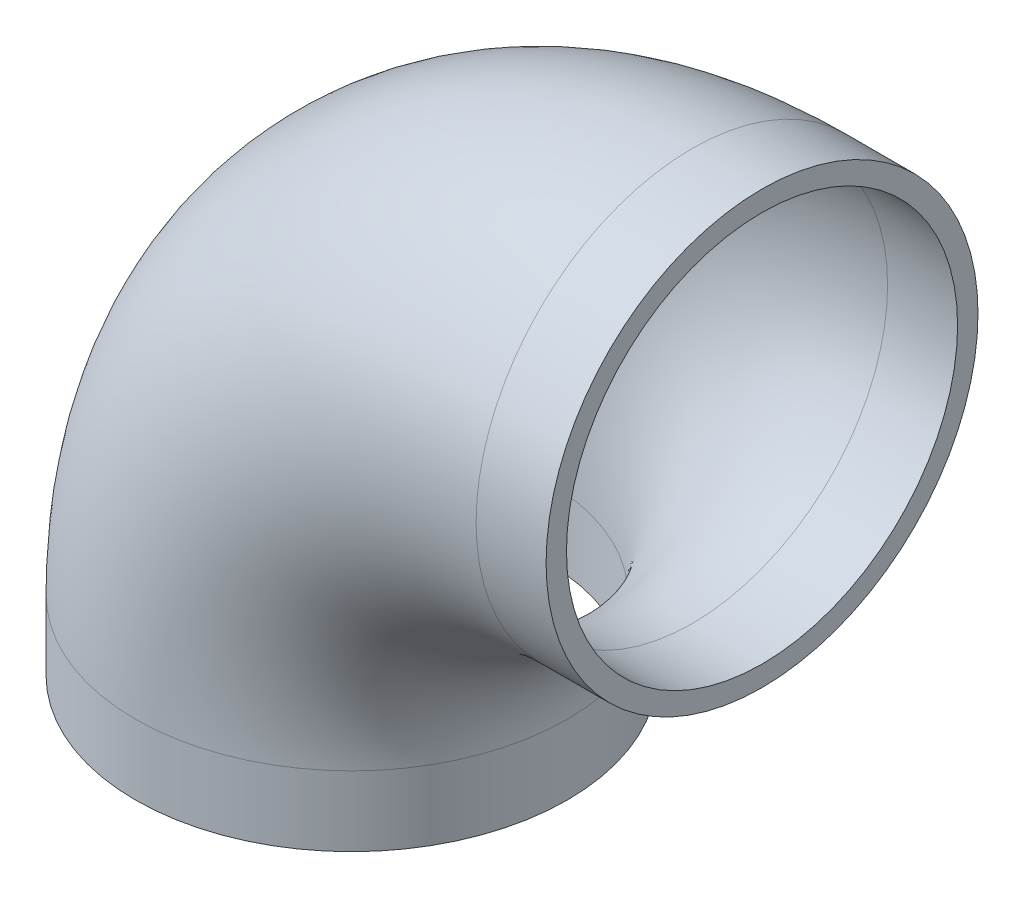
ISO-10303-21;
HEADER;
FILE_DESCRIPTION(('STEP AP214'),'2;1');
FILE_NAME('part.step','',(''),(''),'','','');
FILE_SCHEMA(('AUTOMOTIVE_DESIGN { 1 0 10303 214 1 1 1 1 }'));
ENDSEC;
DATA;
#1=APPLICATION_CONTEXT('core data for automotive mechanical design processes');
#2=APPLICATION_PROTOCOL_DEFINITION('international standard','automotive_design',2000,#1);
#3=PRODUCT_CONTEXT('',#1,'mechanical');
#4=PRODUCT('Part','Part','',(#3));
#5=PRODUCT_RELATED_PRODUCT_CATEGORY('part','',(#4));
#6=PRODUCT_DEFINITION_FORMATION('','',#4);
#7=PRODUCT_DEFINITION_CONTEXT('part definition',#1,'design');
#8=PRODUCT_DEFINITION('design','',#6,#7);
#9=PRODUCT_DEFINITION_SHAPE('','',#8);
#10=(LENGTH_UNIT() NAMED_UNIT(*) SI_UNIT(.MILLI.,.METRE.));
#11=(NAMED_UNIT(*) PLANE_ANGLE_UNIT() SI_UNIT($,.RADIAN.));
#12=(NAMED_UNIT(*) SI_UNIT($,.STERADIAN.) SOLID_ANGLE_UNIT());
#13=UNCERTAINTY_MEASURE_WITH_UNIT(LENGTH_MEASURE(1.E-05),#10,'distance_accuracy_value','');
#14=(GEOMETRIC_REPRESENTATION_CONTEXT(3) GLOBAL_UNCERTAINTY_ASSIGNED_CONTEXT((#13)) GLOBAL_UNIT_ASSIGNED_CONTEXT((#10,
#11,#12)) REPRESENTATION_CONTEXT('',''));
#15=CARTESIAN_POINT('',(0.,0.,0.));
#16=DIRECTION('',(0.,0.,1.));
#17=DIRECTION('',(1.,0.,0.));
#18=AXIS2_PLACEMENT_3D('',#15,#16,#17);
#19=CARTESIAN_POINT('',(0.,0.,0.));
#20=DIRECTION('',(0.,1.,0.));
#21=DIRECTION('',(0.,0.,1.));
#22=AXIS2_PLACEMENT_3D('',#19,#20,#21);
#23=CYLINDRICAL_SURFACE('',#22,84.15);
#24=CARTESIAN_POINT('',(0.,27.27,0.));
#25=DIRECTION('',(0.,1.,0.));
#26=DIRECTION('',(0.,0.,1.));
#27=AXIS2_PLACEMENT_3D('',#24,#25,#26);
#28=CIRCLE('',#27,84.15);
#29=CARTESIAN_POINT('',(-84.15,27.27,0.));
#30=VERTEX_POINT('',#29);
#31=EDGE_CURVE('E66',#30,#30,#28,.T.);
#32=ORIENTED_EDGE('',*,*,#31,.F.);
#33=EDGE_LOOP('',(#32));
#34=FACE_BOUND('',#33,.T.);
#35=CARTESIAN_POINT('',(0.,0.,0.));
#36=DIRECTION('',(0.,1.,0.));
#37=DIRECTION('',(0.,0.,1.));
#38=AXIS2_PLACEMENT_3D('',#35,#36,#37);
#39=CIRCLE('',#38,84.15);
#40=CARTESIAN_POINT('',(0.,0.,84.15));
#41=VERTEX_POINT('',#40);
#42=EDGE_CURVE('E63',#41,#41,#39,.T.);
#43=ORIENTED_EDGE('',*,*,#42,.T.);
#44=EDGE_LOOP('',(#43));
#45=FACE_BOUND('',#44,.T.);
#46=ADVANCED_FACE('F39',(#34,#45),#23,.T.);
#47=CARTESIAN_POINT('',(132.73,27.27,0.));
#48=DIRECTION('',(0.,0.,-1.));
#49=DIRECTION('',(-1.,0.,0.));
#50=AXIS2_PLACEMENT_3D('',#47,#48,#49);
#51=TOROIDAL_SURFACE('',#50,132.73,84.15);
#52=CARTESIAN_POINT('',(132.73,160.,0.));
#53=DIRECTION('',(1.,0.,0.));
#54=DIRECTION('',(0.,0.,1.));
#55=AXIS2_PLACEMENT_3D('',#52,#53,#54);
#56=CIRCLE('',#55,84.15);
#57=CARTESIAN_POINT('',(132.73,244.15,0.));
#58=VERTEX_POINT('',#57);
#59=EDGE_CURVE('E43',#58,#58,#56,.T.);
#60=CARTESIAN_POINT('',(132.73,27.27,0.));
#61=DIRECTION('',(0.,0.,-1.));
#62=DIRECTION('',(-1.,0.,0.));
#63=AXIS2_PLACEMENT_3D('',#60,#61,#62);
#64=CIRCLE('',#63,216.88);
#65=EDGE_CURVE('',#30,#58,#64,.T.);
#66=ORIENTED_EDGE('',*,*,#31,.T.);
#67=ORIENTED_EDGE('',*,*,#59,.F.);
#68=ORIENTED_EDGE('',*,*,#65,.T.);
#69=ORIENTED_EDGE('',*,*,#65,.F.);
#70=EDGE_LOOP('',(#66,#68,#67,#69));
#71=FACE_BOUND('',#70,.T.);
#72=ADVANCED_FACE('F76',(#71),#51,.T.);
#73=CARTESIAN_POINT('',(132.73,160.,0.));
#74=DIRECTION('',(1.,0.,0.));
#75=DIRECTION('',(0.,0.,-1.));
#76=AXIS2_PLACEMENT_3D('',#73,#74,#75);
#77=CYLINDRICAL_SURFACE('',#76,84.15);
#78=CARTESIAN_POINT('',(160.,160.,0.));
#79=DIRECTION('',(1.,0.,0.));
#80=DIRECTION('',(0.,0.,1.));
#81=AXIS2_PLACEMENT_3D('',#78,#79,#80);
#82=CIRCLE('',#81,84.15);
#83=CARTESIAN_POINT('',(160.,160.,84.15));
#84=VERTEX_POINT('',#83);
#85=EDGE_CURVE('E58',#84,#84,#82,.T.);
#86=ORIENTED_EDGE('',*,*,#85,.F.);
#87=EDGE_LOOP('',(#86));
#88=FACE_BOUND('',#87,.T.);
#89=ORIENTED_EDGE('',*,*,#59,.T.);
#90=EDGE_LOOP('',(#89));
#91=FACE_BOUND('',#90,.T.);
#92=ADVANCED_FACE('F41',(#88,#91),#77,.T.);
#93=CARTESIAN_POINT('',(0.,0.,0.));
#94=DIRECTION('',(0.,1.,0.));
#95=DIRECTION('',(0.,0.,1.));
#96=AXIS2_PLACEMENT_3D('',#93,#94,#95);
#97=PLANE('',#96);
#98=CARTESIAN_POINT('',(0.,0.,0.));
#99=DIRECTION('',(0.,1.,0.));
#100=DIRECTION('',(0.,0.,1.));
#101=AXIS2_PLACEMENT_3D('',#98,#99,#100);
#102=CIRCLE('',#101,76.2);
#103=CARTESIAN_POINT('',(0.,0.,76.2));
#104=VERTEX_POINT('',#103);
#105=EDGE_CURVE('E62',#104,#104,#102,.F.);
#106=ORIENTED_EDGE('',*,*,#105,.F.);
#107=EDGE_LOOP('',(#106));
#108=FACE_BOUND('',#107,.T.);
#109=ORIENTED_EDGE('',*,*,#42,.F.);
#110=EDGE_LOOP('',(#109));
#111=FACE_BOUND('',#110,.T.);
#112=ADVANCED_FACE('F82',(#108,#111),#97,.F.);
#113=CARTESIAN_POINT('',(160.,160.,0.));
#114=DIRECTION('',(1.,0.,0.));
#115=DIRECTION('',(0.,0.,1.));
#116=AXIS2_PLACEMENT_3D('',#113,#114,#115);
#117=PLANE('',#116);
#118=CARTESIAN_POINT('',(160.,160.,0.));
#119=DIRECTION('',(1.,0.,0.));
#120=DIRECTION('',(0.,0.,1.));
#121=AXIS2_PLACEMENT_3D('',#118,#119,#120);
#122=CIRCLE('',#121,76.2);
#123=CARTESIAN_POINT('',(160.,160.,76.2));
#124=VERTEX_POINT('',#123);
#125=EDGE_CURVE('E10',#124,#124,#122,.F.);
#126=ORIENTED_EDGE('',*,*,#125,.T.);
#127=EDGE_LOOP('',(#126));
#128=FACE_BOUND('',#127,.T.);
#129=ORIENTED_EDGE('',*,*,#85,.T.);
#130=EDGE_LOOP('',(#129));
#131=FACE_BOUND('',#130,.T.);
#132=ADVANCED_FACE('F100',(#128,#131),#117,.T.);
#133=CARTESIAN_POINT('',(0.,0.,0.));
#134=DIRECTION('',(0.,1.,0.));
#135=DIRECTION('',(0.,0.,1.));
#136=AXIS2_PLACEMENT_3D('',#133,#134,#135);
#137=CYLINDRICAL_SURFACE('',#136,76.2);
#138=CARTESIAN_POINT('',(0.,27.27,0.));
#139=DIRECTION('',(0.,1.,0.));
#140=DIRECTION('',(0.,0.,1.));
#141=AXIS2_PLACEMENT_3D('',#138,#139,#140);
#142=CIRCLE('',#141,76.2);
#143=CARTESIAN_POINT('',(-76.2,27.27,0.));
#144=VERTEX_POINT('',#143);
#145=EDGE_CURVE('E54',#144,#144,#142,.F.);
#146=ORIENTED_EDGE('',*,*,#145,.F.);
#147=EDGE_LOOP('',(#146));
#148=FACE_BOUND('',#147,.T.);
#149=ORIENTED_EDGE('',*,*,#105,.T.);
#150=EDGE_LOOP('',(#149));
#151=FACE_BOUND('',#150,.T.);
#152=ADVANCED_FACE('F94',(#148,#151),#137,.F.);
#153=CARTESIAN_POINT('',(132.73,27.27,0.));
#154=DIRECTION('',(0.,0.,-1.));
#155=DIRECTION('',(-1.,0.,0.));
#156=AXIS2_PLACEMENT_3D('',#153,#154,#155);
#157=TOROIDAL_SURFACE('',#156,132.73,76.2);
#158=CARTESIAN_POINT('',(132.73,160.,0.));
#159=DIRECTION('',(1.,0.,0.));
#160=DIRECTION('',(0.,0.,1.));
#161=AXIS2_PLACEMENT_3D('',#158,#159,#160);
#162=CIRCLE('',#161,76.2);
#163=CARTESIAN_POINT('',(132.73,236.2,0.));
#164=VERTEX_POINT('',#163);
#165=EDGE_CURVE('E48',#164,#164,#162,.F.);
#166=CARTESIAN_POINT('',(132.73,27.27,0.));
#167=DIRECTION('',(0.,0.,-1.));
#168=DIRECTION('',(-1.,0.,0.));
#169=AXIS2_PLACEMENT_3D('',#166,#167,#168);
#170=CIRCLE('',#169,208.93);
#171=EDGE_CURVE('',#144,#164,#170,.T.);
#172=ORIENTED_EDGE('',*,*,#145,.T.);
#173=ORIENTED_EDGE('',*,*,#165,.F.);
#174=ORIENTED_EDGE('',*,*,#171,.T.);
#175=ORIENTED_EDGE('',*,*,#171,.F.);
#176=EDGE_LOOP('',(#172,#174,#173,#175));
#177=FACE_BOUND('',#176,.T.);
#178=ADVANCED_FACE('F88',(#177),#157,.F.);
#179=CARTESIAN_POINT('',(132.73,160.,0.));
#180=DIRECTION('',(1.,0.,0.));
#181=DIRECTION('',(0.,0.,-1.));
#182=AXIS2_PLACEMENT_3D('',#179,#180,#181);
#183=CYLINDRICAL_SURFACE('',#182,76.2);
#184=ORIENTED_EDGE('',*,*,#125,.F.);
#185=EDGE_LOOP('',(#184));
#186=FACE_BOUND('',#185,.T.);
#187=ORIENTED_EDGE('',*,*,#165,.T.);
#188=EDGE_LOOP('',(#187));
#189=FACE_BOUND('',#188,.T.);
#190=ADVANCED_FACE('F86',(#186,#189),#183,.F.);
#191=CLOSED_SHELL('',(#46,#72,#92,#112,#132,#152,#178,#190));
#192=MANIFOLD_SOLID_BREP('B2',#191);
#193=ADVANCED_BREP_SHAPE_REPRESENTATION('',(#18,#192),#14);
#194=SHAPE_DEFINITION_REPRESENTATION(#9,#193);
ENDSEC;
END-ISO-10303-21;
